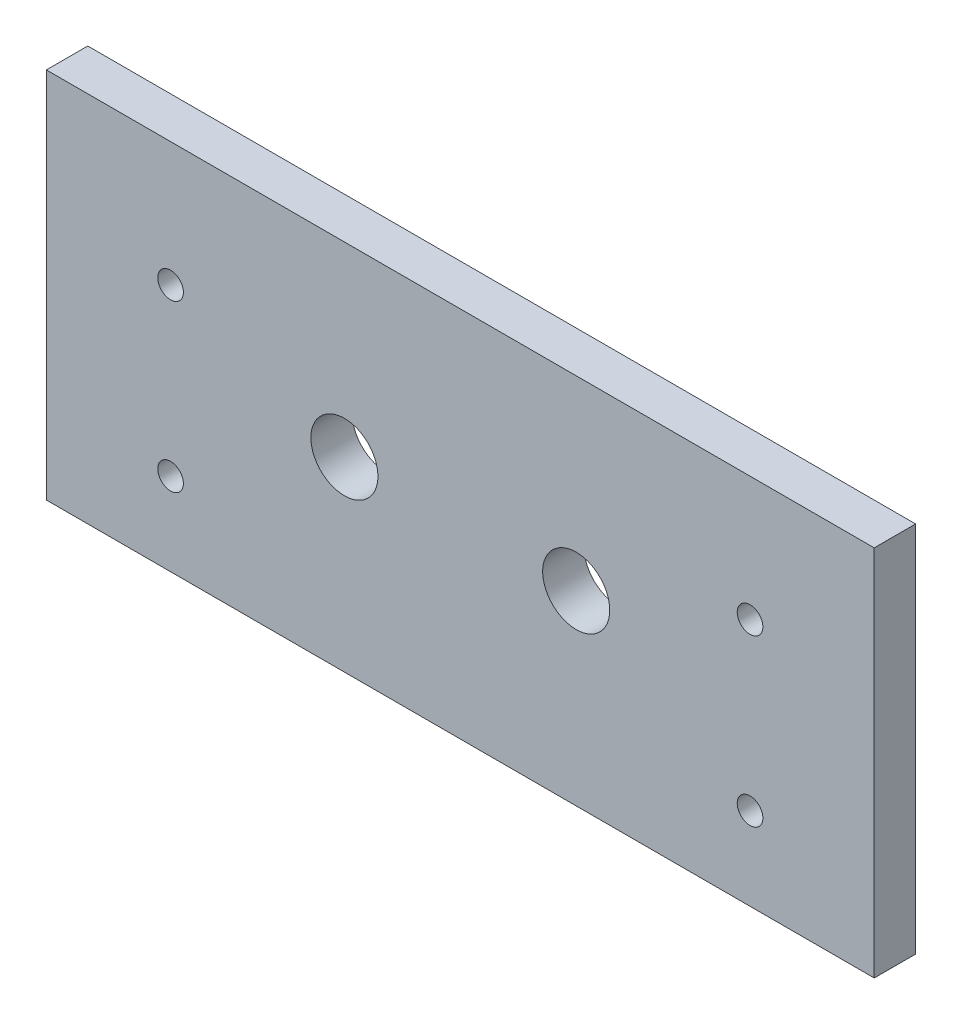
ISO-10303-21;
HEADER;
FILE_DESCRIPTION(('STEP AP214'),'2;1');
FILE_NAME('part.step','',(''),(''),'','','');
FILE_SCHEMA(('AUTOMOTIVE_DESIGN { 1 0 10303 214 1 1 1 1 }'));
ENDSEC;
DATA;
#1=APPLICATION_CONTEXT('core data for automotive mechanical design processes');
#2=APPLICATION_PROTOCOL_DEFINITION('international standard','automotive_design',2000,#1);
#3=PRODUCT_CONTEXT('',#1,'mechanical');
#4=PRODUCT('Part','Part','',(#3));
#5=PRODUCT_RELATED_PRODUCT_CATEGORY('part','',(#4));
#6=PRODUCT_DEFINITION_FORMATION('','',#4);
#7=PRODUCT_DEFINITION_CONTEXT('part definition',#1,'design');
#8=PRODUCT_DEFINITION('design','',#6,#7);
#9=PRODUCT_DEFINITION_SHAPE('','',#8);
#10=(LENGTH_UNIT() NAMED_UNIT(*) SI_UNIT(.MILLI.,.METRE.));
#11=(NAMED_UNIT(*) PLANE_ANGLE_UNIT() SI_UNIT($,.RADIAN.));
#12=(NAMED_UNIT(*) SI_UNIT($,.STERADIAN.) SOLID_ANGLE_UNIT());
#13=UNCERTAINTY_MEASURE_WITH_UNIT(LENGTH_MEASURE(1.E-05),#10,'distance_accuracy_value','');
#14=(GEOMETRIC_REPRESENTATION_CONTEXT(3) GLOBAL_UNCERTAINTY_ASSIGNED_CONTEXT((#13)) GLOBAL_UNIT_ASSIGNED_CONTEXT((#10,
#11,#12)) REPRESENTATION_CONTEXT('',''));
#15=CARTESIAN_POINT('',(0.,0.,0.));
#16=DIRECTION('',(0.,0.,1.));
#17=DIRECTION('',(1.,0.,0.));
#18=AXIS2_PLACEMENT_3D('',#15,#16,#17);
#19=CARTESIAN_POINT('',(50.,-22.5,-5.));
#20=DIRECTION('',(1.,0.,0.));
#21=DIRECTION('',(0.,1.,0.));
#22=AXIS2_PLACEMENT_3D('',#19,#20,#21);
#23=PLANE('',#22);
#24=DIRECTION('',(0.,1.,0.));
#25=VECTOR('',#24,1.);
#26=CARTESIAN_POINT('',(50.,-22.5,0.));
#27=LINE('',#26,#25);
#28=CARTESIAN_POINT('',(50.,-22.5,0.));
#29=VERTEX_POINT('',#28);
#30=CARTESIAN_POINT('',(50.,22.5,0.));
#31=VERTEX_POINT('',#30);
#32=EDGE_CURVE('E98',#29,#31,#27,.T.);
#33=ORIENTED_EDGE('',*,*,#32,.F.);
#34=DIRECTION('',(0.,0.,1.));
#35=VECTOR('',#34,1.);
#36=CARTESIAN_POINT('',(50.,-22.5,-5.));
#37=LINE('',#36,#35);
#38=CARTESIAN_POINT('',(50.,-22.5,-5.));
#39=VERTEX_POINT('',#38);
#40=EDGE_CURVE('E11',#39,#29,#37,.T.);
#41=ORIENTED_EDGE('',*,*,#40,.F.);
#42=DIRECTION('',(0.,1.,0.));
#43=VECTOR('',#42,1.);
#44=CARTESIAN_POINT('',(50.,-22.5,-5.));
#45=LINE('',#44,#43);
#46=CARTESIAN_POINT('',(50.,22.5,-5.));
#47=VERTEX_POINT('',#46);
#48=EDGE_CURVE('E91',#39,#47,#45,.T.);
#49=ORIENTED_EDGE('',*,*,#48,.T.);
#50=DIRECTION('',(0.,0.,1.));
#51=VECTOR('',#50,1.);
#52=CARTESIAN_POINT('',(50.,22.5,-5.));
#53=LINE('',#52,#51);
#54=EDGE_CURVE('E36',#47,#31,#53,.T.);
#55=ORIENTED_EDGE('',*,*,#54,.T.);
#56=EDGE_LOOP('',(#33,#41,#49,#55));
#57=FACE_BOUND('',#56,.T.);
#58=ADVANCED_FACE('F33',(#57),#23,.T.);
#59=CARTESIAN_POINT('',(-50.,-22.5,-5.));
#60=DIRECTION('',(0.,-1.,0.));
#61=DIRECTION('',(0.,0.,-1.));
#62=AXIS2_PLACEMENT_3D('',#59,#60,#61);
#63=PLANE('',#62);
#64=DIRECTION('',(1.,0.,0.));
#65=VECTOR('',#64,1.);
#66=CARTESIAN_POINT('',(-50.,-22.5,0.));
#67=LINE('',#66,#65);
#68=CARTESIAN_POINT('',(-50.,-22.5,0.));
#69=VERTEX_POINT('',#68);
#70=EDGE_CURVE('E93',#69,#29,#67,.T.);
#71=ORIENTED_EDGE('',*,*,#70,.F.);
#72=DIRECTION('',(0.,0.,1.));
#73=VECTOR('',#72,1.);
#74=CARTESIAN_POINT('',(-50.,-22.5,-5.));
#75=LINE('',#74,#73);
#76=CARTESIAN_POINT('',(-50.,-22.5,-5.));
#77=VERTEX_POINT('',#76);
#78=EDGE_CURVE('E42',#77,#69,#75,.T.);
#79=ORIENTED_EDGE('',*,*,#78,.F.);
#80=DIRECTION('',(1.,0.,0.));
#81=VECTOR('',#80,1.);
#82=CARTESIAN_POINT('',(-50.,-22.5,-5.));
#83=LINE('',#82,#81);
#84=EDGE_CURVE('E88',#77,#39,#83,.T.);
#85=ORIENTED_EDGE('',*,*,#84,.T.);
#86=ORIENTED_EDGE('',*,*,#40,.T.);
#87=EDGE_LOOP('',(#71,#79,#85,#86));
#88=FACE_BOUND('',#87,.T.);
#89=ADVANCED_FACE('F109',(#88),#63,.T.);
#90=CARTESIAN_POINT('',(-50.,-22.5,-5.));
#91=DIRECTION('',(-1.,0.,0.));
#92=DIRECTION('',(0.,0.,1.));
#93=AXIS2_PLACEMENT_3D('',#90,#91,#92);
#94=PLANE('',#93);
#95=DIRECTION('',(0.,-1.,0.));
#96=VECTOR('',#95,1.);
#97=CARTESIAN_POINT('',(-50.,-22.5,0.));
#98=LINE('',#97,#96);
#99=CARTESIAN_POINT('',(-50.,22.5,0.));
#100=VERTEX_POINT('',#99);
#101=EDGE_CURVE('E83',#100,#69,#98,.T.);
#102=ORIENTED_EDGE('',*,*,#101,.F.);
#103=DIRECTION('',(0.,0.,1.));
#104=VECTOR('',#103,1.);
#105=CARTESIAN_POINT('',(-50.,22.5,-5.));
#106=LINE('',#105,#104);
#107=CARTESIAN_POINT('',(-50.,22.5,-5.));
#108=VERTEX_POINT('',#107);
#109=EDGE_CURVE('E78',#108,#100,#106,.T.);
#110=ORIENTED_EDGE('',*,*,#109,.F.);
#111=DIRECTION('',(0.,-1.,0.));
#112=VECTOR('',#111,1.);
#113=CARTESIAN_POINT('',(-50.,-22.5,-5.));
#114=LINE('',#113,#112);
#115=EDGE_CURVE('E81',#108,#77,#114,.T.);
#116=ORIENTED_EDGE('',*,*,#115,.T.);
#117=ORIENTED_EDGE('',*,*,#78,.T.);
#118=EDGE_LOOP('',(#102,#110,#116,#117));
#119=FACE_BOUND('',#118,.T.);
#120=ADVANCED_FACE('F80',(#119),#94,.T.);
#121=CARTESIAN_POINT('',(-50.,22.5,-5.));
#122=DIRECTION('',(0.,1.,0.));
#123=DIRECTION('',(-1.,0.,0.));
#124=AXIS2_PLACEMENT_3D('',#121,#122,#123);
#125=PLANE('',#124);
#126=DIRECTION('',(-1.,0.,0.));
#127=VECTOR('',#126,1.);
#128=CARTESIAN_POINT('',(-50.,22.5,0.));
#129=LINE('',#128,#127);
#130=EDGE_CURVE('E101',#31,#100,#129,.T.);
#131=ORIENTED_EDGE('',*,*,#130,.F.);
#132=ORIENTED_EDGE('',*,*,#54,.F.);
#133=DIRECTION('',(-1.,0.,0.));
#134=VECTOR('',#133,1.);
#135=CARTESIAN_POINT('',(-50.,22.5,-5.));
#136=LINE('',#135,#134);
#137=EDGE_CURVE('E87',#47,#108,#136,.T.);
#138=ORIENTED_EDGE('',*,*,#137,.T.);
#139=ORIENTED_EDGE('',*,*,#109,.T.);
#140=EDGE_LOOP('',(#131,#132,#138,#139));
#141=FACE_BOUND('',#140,.T.);
#142=ADVANCED_FACE('F90',(#141),#125,.T.);
#143=CARTESIAN_POINT('',(0.,0.,-5.));
#144=DIRECTION('',(0.,0.,-1.));
#145=DIRECTION('',(-1.,0.,0.));
#146=AXIS2_PLACEMENT_3D('',#143,#144,#145);
#147=PLANE('',#146);
#148=CARTESIAN_POINT('',(-14.,0.,-5.));
#149=DIRECTION('',(0.,0.,1.));
#150=DIRECTION('',(-1.,0.,0.));
#151=AXIS2_PLACEMENT_3D('',#148,#149,#150);
#152=CIRCLE('',#151,4.05000000000001);
#153=CARTESIAN_POINT('',(-18.05,0.,-5.));
#154=VERTEX_POINT('',#153);
#155=EDGE_CURVE('E158',#154,#154,#152,.T.);
#156=ORIENTED_EDGE('',*,*,#155,.T.);
#157=EDGE_LOOP('',(#156));
#158=FACE_BOUND('',#157,.T.);
#159=CARTESIAN_POINT('',(14.,0.,-5.));
#160=DIRECTION('',(0.,0.,1.));
#161=DIRECTION('',(1.,0.,0.));
#162=AXIS2_PLACEMENT_3D('',#159,#160,#161);
#163=CIRCLE('',#162,4.05);
#164=CARTESIAN_POINT('',(18.05,0.,-5.));
#165=VERTEX_POINT('',#164);
#166=EDGE_CURVE('E166',#165,#165,#163,.T.);
#167=ORIENTED_EDGE('',*,*,#166,.T.);
#168=EDGE_LOOP('',(#167));
#169=FACE_BOUND('',#168,.T.);
#170=CARTESIAN_POINT('',(35.,7.5,-5.));
#171=DIRECTION('',(0.,0.,1.));
#172=DIRECTION('',(-1.,0.,0.));
#173=AXIS2_PLACEMENT_3D('',#170,#171,#172);
#174=CIRCLE('',#173,1.55);
#175=CARTESIAN_POINT('',(33.45,7.5,-5.));
#176=VERTEX_POINT('',#175);
#177=EDGE_CURVE('E172',#176,#176,#174,.T.);
#178=ORIENTED_EDGE('',*,*,#177,.T.);
#179=EDGE_LOOP('',(#178));
#180=FACE_BOUND('',#179,.T.);
#181=CARTESIAN_POINT('',(35.,-12.5,-5.));
#182=DIRECTION('',(0.,0.,1.));
#183=DIRECTION('',(-1.,0.,0.));
#184=AXIS2_PLACEMENT_3D('',#181,#182,#183);
#185=CIRCLE('',#184,1.55);
#186=CARTESIAN_POINT('',(33.45,-12.5,-5.));
#187=VERTEX_POINT('',#186);
#188=EDGE_CURVE('E178',#187,#187,#185,.T.);
#189=ORIENTED_EDGE('',*,*,#188,.T.);
#190=EDGE_LOOP('',(#189));
#191=FACE_BOUND('',#190,.T.);
#192=CARTESIAN_POINT('',(-35.,7.5,-5.));
#193=DIRECTION('',(0.,0.,1.));
#194=DIRECTION('',(1.,0.,0.));
#195=AXIS2_PLACEMENT_3D('',#192,#193,#194);
#196=CIRCLE('',#195,1.55);
#197=CARTESIAN_POINT('',(-33.45,7.5,-5.));
#198=VERTEX_POINT('',#197);
#199=EDGE_CURVE('E184',#198,#198,#196,.T.);
#200=ORIENTED_EDGE('',*,*,#199,.T.);
#201=EDGE_LOOP('',(#200));
#202=FACE_BOUND('',#201,.T.);
#203=CARTESIAN_POINT('',(-35.,-12.5,-5.));
#204=DIRECTION('',(0.,0.,1.));
#205=DIRECTION('',(1.,0.,0.));
#206=AXIS2_PLACEMENT_3D('',#203,#204,#205);
#207=CIRCLE('',#206,1.55);
#208=CARTESIAN_POINT('',(-33.45,-12.5,-5.));
#209=VERTEX_POINT('',#208);
#210=EDGE_CURVE('E102',#209,#209,#207,.T.);
#211=ORIENTED_EDGE('',*,*,#210,.T.);
#212=EDGE_LOOP('',(#211));
#213=FACE_BOUND('',#212,.T.);
#214=ORIENTED_EDGE('',*,*,#48,.F.);
#215=ORIENTED_EDGE('',*,*,#84,.F.);
#216=ORIENTED_EDGE('',*,*,#115,.F.);
#217=ORIENTED_EDGE('',*,*,#137,.F.);
#218=EDGE_LOOP('',(#214,#215,#216,#217));
#219=FACE_BOUND('',#218,.T.);
#220=ADVANCED_FACE('F86',(#158,#169,#180,#191,#202,#213,#219),#147,.T.);
#221=CARTESIAN_POINT('',(0.,0.,0.));
#222=DIRECTION('',(0.,0.,-1.));
#223=DIRECTION('',(-1.,0.,0.));
#224=AXIS2_PLACEMENT_3D('',#221,#222,#223);
#225=PLANE('',#224);
#226=CARTESIAN_POINT('',(-14.,0.,0.));
#227=DIRECTION('',(0.,0.,1.));
#228=DIRECTION('',(-1.,0.,0.));
#229=AXIS2_PLACEMENT_3D('',#226,#227,#228);
#230=CIRCLE('',#229,4.05000000000001);
#231=CARTESIAN_POINT('',(-18.05,0.,0.));
#232=VERTEX_POINT('',#231);
#233=EDGE_CURVE('E161',#232,#232,#230,.T.);
#234=ORIENTED_EDGE('',*,*,#233,.F.);
#235=EDGE_LOOP('',(#234));
#236=FACE_BOUND('',#235,.T.);
#237=CARTESIAN_POINT('',(14.,0.,0.));
#238=DIRECTION('',(0.,0.,1.));
#239=DIRECTION('',(1.,0.,0.));
#240=AXIS2_PLACEMENT_3D('',#237,#238,#239);
#241=CIRCLE('',#240,4.05);
#242=CARTESIAN_POINT('',(18.05,0.,0.));
#243=VERTEX_POINT('',#242);
#244=EDGE_CURVE('E163',#243,#243,#241,.T.);
#245=ORIENTED_EDGE('',*,*,#244,.F.);
#246=EDGE_LOOP('',(#245));
#247=FACE_BOUND('',#246,.T.);
#248=CARTESIAN_POINT('',(35.,7.5,0.));
#249=DIRECTION('',(0.,0.,1.));
#250=DIRECTION('',(-1.,0.,0.));
#251=AXIS2_PLACEMENT_3D('',#248,#249,#250);
#252=CIRCLE('',#251,1.55);
#253=CARTESIAN_POINT('',(33.45,7.5,0.));
#254=VERTEX_POINT('',#253);
#255=EDGE_CURVE('E169',#254,#254,#252,.T.);
#256=ORIENTED_EDGE('',*,*,#255,.F.);
#257=EDGE_LOOP('',(#256));
#258=FACE_BOUND('',#257,.T.);
#259=CARTESIAN_POINT('',(35.,-12.5,0.));
#260=DIRECTION('',(0.,0.,1.));
#261=DIRECTION('',(-1.,0.,0.));
#262=AXIS2_PLACEMENT_3D('',#259,#260,#261);
#263=CIRCLE('',#262,1.55);
#264=CARTESIAN_POINT('',(33.45,-12.5,0.));
#265=VERTEX_POINT('',#264);
#266=EDGE_CURVE('E175',#265,#265,#263,.T.);
#267=ORIENTED_EDGE('',*,*,#266,.F.);
#268=EDGE_LOOP('',(#267));
#269=FACE_BOUND('',#268,.T.);
#270=CARTESIAN_POINT('',(-35.,7.5,0.));
#271=DIRECTION('',(0.,0.,1.));
#272=DIRECTION('',(1.,0.,0.));
#273=AXIS2_PLACEMENT_3D('',#270,#271,#272);
#274=CIRCLE('',#273,1.55);
#275=CARTESIAN_POINT('',(-33.45,7.5,0.));
#276=VERTEX_POINT('',#275);
#277=EDGE_CURVE('E181',#276,#276,#274,.T.);
#278=ORIENTED_EDGE('',*,*,#277,.F.);
#279=EDGE_LOOP('',(#278));
#280=FACE_BOUND('',#279,.T.);
#281=CARTESIAN_POINT('',(-35.,-12.5,0.));
#282=DIRECTION('',(0.,0.,1.));
#283=DIRECTION('',(1.,0.,0.));
#284=AXIS2_PLACEMENT_3D('',#281,#282,#283);
#285=CIRCLE('',#284,1.55);
#286=CARTESIAN_POINT('',(-33.45,-12.5,0.));
#287=VERTEX_POINT('',#286);
#288=EDGE_CURVE('E187',#287,#287,#285,.T.);
#289=ORIENTED_EDGE('',*,*,#288,.F.);
#290=EDGE_LOOP('',(#289));
#291=FACE_BOUND('',#290,.T.);
#292=ORIENTED_EDGE('',*,*,#32,.T.);
#293=ORIENTED_EDGE('',*,*,#130,.T.);
#294=ORIENTED_EDGE('',*,*,#101,.T.);
#295=ORIENTED_EDGE('',*,*,#70,.T.);
#296=EDGE_LOOP('',(#292,#293,#294,#295));
#297=FACE_BOUND('',#296,.T.);
#298=ADVANCED_FACE('F108',(#236,#247,#258,#269,#280,#291,#297),#225,.F.);
#299=CARTESIAN_POINT('',(-35.,-12.5,-5.));
#300=DIRECTION('',(0.,0.,1.));
#301=DIRECTION('',(1.,0.,0.));
#302=AXIS2_PLACEMENT_3D('',#299,#300,#301);
#303=CYLINDRICAL_SURFACE('',#302,1.55);
#304=ORIENTED_EDGE('',*,*,#210,.F.);
#305=EDGE_LOOP('',(#304));
#306=FACE_BOUND('',#305,.T.);
#307=ORIENTED_EDGE('',*,*,#288,.T.);
#308=EDGE_LOOP('',(#307));
#309=FACE_BOUND('',#308,.T.);
#310=ADVANCED_FACE('F127',(#306,#309),#303,.F.);
#311=CARTESIAN_POINT('',(-35.,7.5,-5.));
#312=DIRECTION('',(0.,0.,1.));
#313=DIRECTION('',(1.,0.,0.));
#314=AXIS2_PLACEMENT_3D('',#311,#312,#313);
#315=CYLINDRICAL_SURFACE('',#314,1.55);
#316=ORIENTED_EDGE('',*,*,#199,.F.);
#317=EDGE_LOOP('',(#316));
#318=FACE_BOUND('',#317,.T.);
#319=ORIENTED_EDGE('',*,*,#277,.T.);
#320=EDGE_LOOP('',(#319));
#321=FACE_BOUND('',#320,.T.);
#322=ADVANCED_FACE('F134',(#318,#321),#315,.F.);
#323=CARTESIAN_POINT('',(35.,-12.5,-5.));
#324=DIRECTION('',(0.,0.,1.));
#325=DIRECTION('',(1.,0.,0.));
#326=AXIS2_PLACEMENT_3D('',#323,#324,#325);
#327=CYLINDRICAL_SURFACE('',#326,1.55);
#328=ORIENTED_EDGE('',*,*,#188,.F.);
#329=EDGE_LOOP('',(#328));
#330=FACE_BOUND('',#329,.T.);
#331=ORIENTED_EDGE('',*,*,#266,.T.);
#332=EDGE_LOOP('',(#331));
#333=FACE_BOUND('',#332,.T.);
#334=ADVANCED_FACE('F138',(#330,#333),#327,.F.);
#335=CARTESIAN_POINT('',(35.,7.5,-5.));
#336=DIRECTION('',(0.,0.,1.));
#337=DIRECTION('',(1.,0.,0.));
#338=AXIS2_PLACEMENT_3D('',#335,#336,#337);
#339=CYLINDRICAL_SURFACE('',#338,1.55);
#340=ORIENTED_EDGE('',*,*,#177,.F.);
#341=EDGE_LOOP('',(#340));
#342=FACE_BOUND('',#341,.T.);
#343=ORIENTED_EDGE('',*,*,#255,.T.);
#344=EDGE_LOOP('',(#343));
#345=FACE_BOUND('',#344,.T.);
#346=ADVANCED_FACE('F142',(#342,#345),#339,.F.);
#347=CARTESIAN_POINT('',(14.,0.,-5.));
#348=DIRECTION('',(0.,0.,1.));
#349=DIRECTION('',(1.,0.,0.));
#350=AXIS2_PLACEMENT_3D('',#347,#348,#349);
#351=CYLINDRICAL_SURFACE('',#350,4.05);
#352=ORIENTED_EDGE('',*,*,#166,.F.);
#353=EDGE_LOOP('',(#352));
#354=FACE_BOUND('',#353,.T.);
#355=ORIENTED_EDGE('',*,*,#244,.T.);
#356=EDGE_LOOP('',(#355));
#357=FACE_BOUND('',#356,.T.);
#358=ADVANCED_FACE('F146',(#354,#357),#351,.F.);
#359=CARTESIAN_POINT('',(-14.,0.,-5.));
#360=DIRECTION('',(0.,0.,1.));
#361=DIRECTION('',(1.,0.,0.));
#362=AXIS2_PLACEMENT_3D('',#359,#360,#361);
#363=CYLINDRICAL_SURFACE('',#362,4.05000000000001);
#364=ORIENTED_EDGE('',*,*,#155,.F.);
#365=EDGE_LOOP('',(#364));
#366=FACE_BOUND('',#365,.T.);
#367=ORIENTED_EDGE('',*,*,#233,.T.);
#368=EDGE_LOOP('',(#367));
#369=FACE_BOUND('',#368,.T.);
#370=ADVANCED_FACE('F150',(#366,#369),#363,.F.);
#371=CLOSED_SHELL('',(#58,#89,#120,#142,#220,#298,#310,#322,#334,#346,#358,#370));
#372=MANIFOLD_SOLID_BREP('B2',#371);
#373=ADVANCED_BREP_SHAPE_REPRESENTATION('',(#18,#372),#14);
#374=SHAPE_DEFINITION_REPRESENTATION(#9,#373);
ENDSEC;
END-ISO-10303-21;
